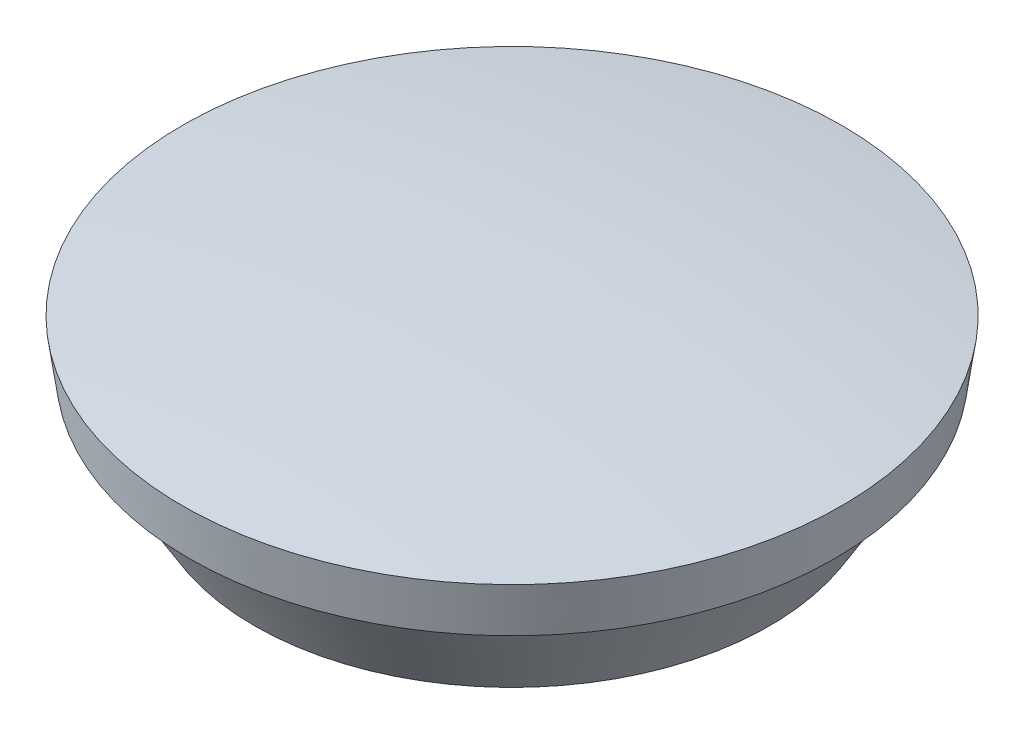
ISO-10303-21;
HEADER;
FILE_DESCRIPTION(('STEP AP214'),'2;1');
FILE_NAME('part.step','',(''),(''),'','','');
FILE_SCHEMA(('AUTOMOTIVE_DESIGN { 1 0 10303 214 1 1 1 1 }'));
ENDSEC;
DATA;
#1=APPLICATION_CONTEXT('core data for automotive mechanical design processes');
#2=APPLICATION_PROTOCOL_DEFINITION('international standard','automotive_design',2000,#1);
#3=PRODUCT_CONTEXT('',#1,'mechanical');
#4=PRODUCT('Part','Part','',(#3));
#5=PRODUCT_RELATED_PRODUCT_CATEGORY('part','',(#4));
#6=PRODUCT_DEFINITION_FORMATION('','',#4);
#7=PRODUCT_DEFINITION_CONTEXT('part definition',#1,'design');
#8=PRODUCT_DEFINITION('design','',#6,#7);
#9=PRODUCT_DEFINITION_SHAPE('','',#8);
#10=(LENGTH_UNIT() NAMED_UNIT(*) SI_UNIT(.MILLI.,.METRE.));
#11=(NAMED_UNIT(*) PLANE_ANGLE_UNIT() SI_UNIT($,.RADIAN.));
#12=(NAMED_UNIT(*) SI_UNIT($,.STERADIAN.) SOLID_ANGLE_UNIT());
#13=UNCERTAINTY_MEASURE_WITH_UNIT(LENGTH_MEASURE(1.E-05),#10,'distance_accuracy_value','');
#14=(GEOMETRIC_REPRESENTATION_CONTEXT(3) GLOBAL_UNCERTAINTY_ASSIGNED_CONTEXT((#13)) GLOBAL_UNIT_ASSIGNED_CONTEXT((#10,
#11,#12)) REPRESENTATION_CONTEXT('',''));
#15=CARTESIAN_POINT('',(0.,0.,0.));
#16=DIRECTION('',(0.,0.,1.));
#17=DIRECTION('',(1.,0.,0.));
#18=AXIS2_PLACEMENT_3D('',#15,#16,#17);
#19=CARTESIAN_POINT('',(0.,321.561079724369,1.01393428618166E-12));
#20=DIRECTION('',(0.,1.,0.));
#21=DIRECTION('',(0.,0.,1.));
#22=AXIS2_PLACEMENT_3D('',#19,#20,#21);
#23=CONICAL_SURFACE('',#22,46.181267187361,0.142640506657348);
#24=CARTESIAN_POINT('',(0.,328.628234589977,1.03657014094382E-12));
#25=DIRECTION('',(0.,-1.,0.));
#26=DIRECTION('',(0.,0.,-1.));
#27=AXIS2_PLACEMENT_3D('',#24,#25,#26);
#28=CIRCLE('',#27,47.1962226271886);
#29=CARTESIAN_POINT('',(0.,328.628234589977,-47.1962226271876));
#30=VERTEX_POINT('',#29);
#31=EDGE_CURVE('E11',#30,#30,#28,.T.);
#32=ORIENTED_EDGE('',*,*,#31,.T.);
#33=EDGE_LOOP('',(#32));
#34=FACE_BOUND('',#33,.T.);
#35=CARTESIAN_POINT('',(0.,321.561079724369,1.01393428618166E-12));
#36=DIRECTION('',(0.,-1.,0.));
#37=DIRECTION('',(0.,0.,-1.));
#38=AXIS2_PLACEMENT_3D('',#35,#36,#37);
#39=CIRCLE('',#38,46.181267187361);
#40=CARTESIAN_POINT('',(0.,321.561079724369,-46.1812671873599));
#41=VERTEX_POINT('',#40);
#42=EDGE_CURVE('E64',#41,#41,#39,.T.);
#43=ORIENTED_EDGE('',*,*,#42,.F.);
#44=EDGE_LOOP('',(#43));
#45=FACE_BOUND('',#44,.T.);
#46=ADVANCED_FACE('F32',(#34,#45),#23,.T.);
#47=CARTESIAN_POINT('',(0.,-1.0680345496894E-10,9.40567068674625E-12));
#48=DIRECTION('',(0.,-1.,0.));
#49=DIRECTION('',(0.,0.,-1.));
#50=AXIS2_PLACEMENT_3D('',#47,#48,#49);
#51=SPHERICAL_SURFACE('',#50,332.000000000107);
#52=ORIENTED_EDGE('',*,*,#31,.F.);
#53=EDGE_LOOP('',(#52));
#54=FACE_BOUND('',#53,.T.);
#55=ADVANCED_FACE('F44',(#54),#51,.T.);
#56=CARTESIAN_POINT('',(0.,274.04557242889,-0.772549145363541));
#57=DIRECTION('',(-1.,0.,0.));
#58=DIRECTION('',(0.,0.,-1.));
#59=AXIS2_PLACEMENT_3D('',#56,#57,#58);
#60=CIRCLE('',#59,49.9604009805697);
#61=TRIMMED_CURVE('',#60,(PARAMETER_VALUE(-1.58626017258224)),
(PARAMETER_VALUE(1.58626017258224)),.T.,.PARAMETER.);
#62=CARTESIAN_POINT('',(0.,274.04557242889,8.61723886691479E-13));
#63=DIRECTION('',(0.,-1.,0.));
#64=AXIS1_PLACEMENT('',#62,#63);
#65=SURFACE_OF_REVOLUTION('',#61,#64);
#66=CARTESIAN_POINT('',(0.,308.576990629941,9.72346693925712E-13));
#67=DIRECTION('',(0.,-1.,0.));
#68=DIRECTION('',(0.,0.,-1.));
#69=AXIS2_PLACEMENT_3D('',#66,#67,#68);
#70=CIRCLE('',#69,36.8782664649723);
#71=CARTESIAN_POINT('',(0.,308.576990629941,-36.8782664649713));
#72=VERTEX_POINT('',#71);
#73=EDGE_CURVE('E38',#72,#72,#70,.T.);
#74=ORIENTED_EDGE('',*,*,#73,.T.);
#75=EDGE_LOOP('',(#74));
#76=FACE_BOUND('',#75,.T.);
#77=CARTESIAN_POINT('',(0.,324.,1.29280267047172E-12));
#78=VERTEX_POINT('',#77);
#79=VERTEX_LOOP('',#78);
#80=FACE_BOUND('',#79,.T.);
#81=ADVANCED_FACE('F41',(#76,#80),#65,.F.);
#82=CARTESIAN_POINT('',(0.,308.576990629941,9.72346693925712E-13));
#83=DIRECTION('',(0.,1.,0.));
#84=DIRECTION('',(0.,0.,1.));
#85=AXIS2_PLACEMENT_3D('',#82,#83,#84);
#86=CONICAL_SURFACE('',#85,36.8782664649723,0.546433290900082);
#87=CARTESIAN_POINT('',(0.,321.561079724369,1.01393428618166E-12));
#88=DIRECTION('',(0.,-1.,0.));
#89=DIRECTION('',(0.,0.,-1.));
#90=AXIS2_PLACEMENT_3D('',#87,#88,#89);
#91=CIRCLE('',#90,44.775299461623);
#92=CARTESIAN_POINT('',(0.,321.561079724369,-44.775299461622));
#93=VERTEX_POINT('',#92);
#94=EDGE_CURVE('E66',#93,#93,#91,.T.);
#95=ORIENTED_EDGE('',*,*,#94,.T.);
#96=EDGE_LOOP('',(#95));
#97=FACE_BOUND('',#96,.T.);
#98=ORIENTED_EDGE('',*,*,#73,.F.);
#99=EDGE_LOOP('',(#98));
#100=FACE_BOUND('',#99,.T.);
#101=ADVANCED_FACE('F43',(#97,#100),#86,.T.);
#102=CARTESIAN_POINT('',(0.,321.561079724369,-46.1812671873599));
#103=DIRECTION('',(0.,-1.,0.));
#104=DIRECTION('',(0.,0.,-1.));
#105=AXIS2_PLACEMENT_3D('',#102,#103,#104);
#106=PLANE('',#105);
#107=ORIENTED_EDGE('',*,*,#42,.T.);
#108=EDGE_LOOP('',(#107));
#109=FACE_BOUND('',#108,.T.);
#110=ORIENTED_EDGE('',*,*,#94,.F.);
#111=EDGE_LOOP('',(#110));
#112=FACE_BOUND('',#111,.T.);
#113=ADVANCED_FACE('F51',(#109,#112),#106,.T.);
#114=CLOSED_SHELL('',(#46,#55,#81,#101,#113));
#115=MANIFOLD_SOLID_BREP('B2',#114);
#116=ADVANCED_BREP_SHAPE_REPRESENTATION('',(#18,#115),#14);
#117=SHAPE_DEFINITION_REPRESENTATION(#9,#116);
ENDSEC;
END-ISO-10303-21;
